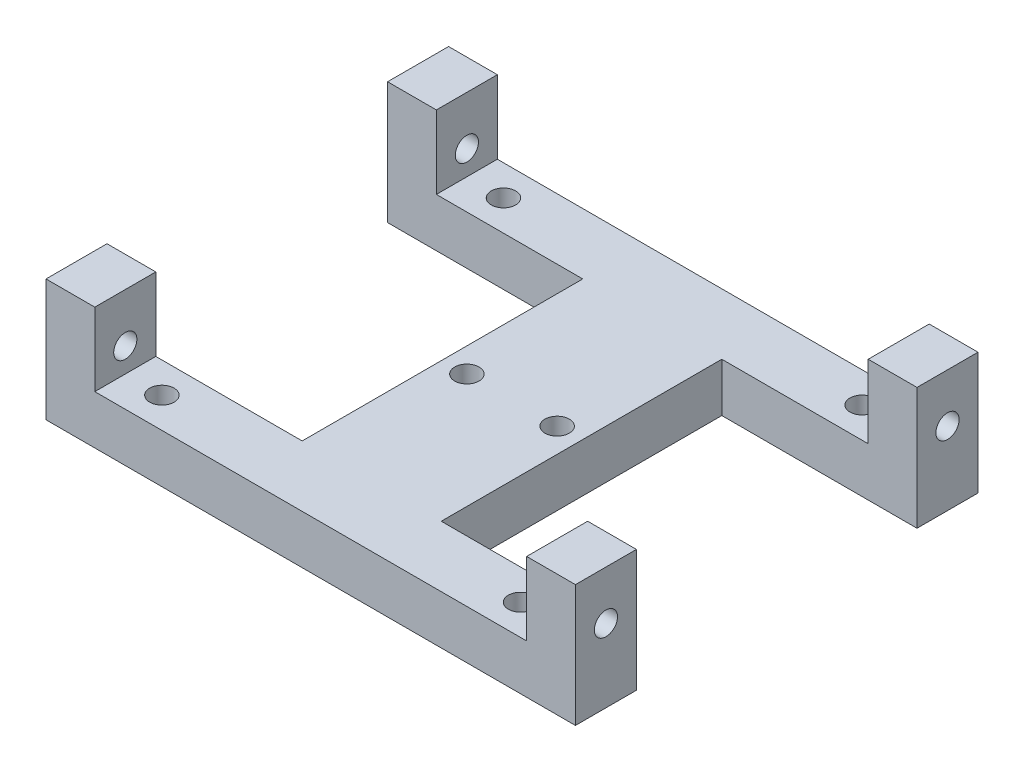
ISO-10303-21;
HEADER;
FILE_DESCRIPTION(('STEP AP214'),'2;1');
FILE_NAME('part.step','',(''),(''),'','','');
FILE_SCHEMA(('AUTOMOTIVE_DESIGN { 1 0 10303 214 1 1 1 1 }'));
ENDSEC;
DATA;
#1=APPLICATION_CONTEXT('core data for automotive mechanical design processes');
#2=APPLICATION_PROTOCOL_DEFINITION('international standard','automotive_design',2000,#1);
#3=PRODUCT_CONTEXT('',#1,'mechanical');
#4=PRODUCT('Part','Part','',(#3));
#5=PRODUCT_RELATED_PRODUCT_CATEGORY('part','',(#4));
#6=PRODUCT_DEFINITION_FORMATION('','',#4);
#7=PRODUCT_DEFINITION_CONTEXT('part definition',#1,'design');
#8=PRODUCT_DEFINITION('design','',#6,#7);
#9=PRODUCT_DEFINITION_SHAPE('','',#8);
#10=(LENGTH_UNIT() NAMED_UNIT(*) SI_UNIT(.MILLI.,.METRE.));
#11=(NAMED_UNIT(*) PLANE_ANGLE_UNIT() SI_UNIT($,.RADIAN.));
#12=(NAMED_UNIT(*) SI_UNIT($,.STERADIAN.) SOLID_ANGLE_UNIT());
#13=UNCERTAINTY_MEASURE_WITH_UNIT(LENGTH_MEASURE(1.E-05),#10,'distance_accuracy_value','');
#14=(GEOMETRIC_REPRESENTATION_CONTEXT(3) GLOBAL_UNCERTAINTY_ASSIGNED_CONTEXT((#13)) GLOBAL_UNIT_ASSIGNED_CONTEXT((#10,
#11,#12)) REPRESENTATION_CONTEXT('',''));
#15=CARTESIAN_POINT('',(0.,0.,0.));
#16=DIRECTION('',(0.,0.,1.));
#17=DIRECTION('',(1.,0.,0.));
#18=AXIS2_PLACEMENT_3D('',#15,#16,#17);
#19=CARTESIAN_POINT('',(0.,4.,0.));
#20=DIRECTION('',(0.,1.,0.));
#21=DIRECTION('',(0.,0.,1.));
#22=AXIS2_PLACEMENT_3D('',#19,#20,#21);
#23=PLANE('',#22);
#24=CARTESIAN_POINT('',(7.,4.,-25.5));
#25=DIRECTION('',(0.,1.,0.));
#26=DIRECTION('',(0.,0.,1.));
#27=AXIS2_PLACEMENT_3D('',#24,#25,#26);
#28=CIRCLE('',#27,1.);
#29=CARTESIAN_POINT('',(7.,4.,-24.5));
#30=VERTEX_POINT('',#29);
#31=EDGE_CURVE('E390',#30,#30,#28,.T.);
#32=ORIENTED_EDGE('',*,*,#31,.F.);
#33=EDGE_LOOP('',(#32));
#34=FACE_BOUND('',#33,.T.);
#35=CARTESIAN_POINT('',(18.,4.,-11.5));
#36=DIRECTION('',(0.,1.,0.));
#37=DIRECTION('',(0.,0.,1.));
#38=AXIS2_PLACEMENT_3D('',#35,#36,#37);
#39=CIRCLE('',#38,1.);
#40=CARTESIAN_POINT('',(18.,4.,-10.5));
#41=VERTEX_POINT('',#40);
#42=EDGE_CURVE('E384',#41,#41,#39,.T.);
#43=ORIENTED_EDGE('',*,*,#42,.F.);
#44=EDGE_LOOP('',(#43));
#45=FACE_BOUND('',#44,.T.);
#46=CARTESIAN_POINT('',(36.4,4.,2.5));
#47=DIRECTION('',(0.,1.,0.));
#48=DIRECTION('',(0.,0.,-1.));
#49=AXIS2_PLACEMENT_3D('',#46,#47,#48);
#50=CIRCLE('',#49,0.999999999999998);
#51=CARTESIAN_POINT('',(36.4,4.,1.5));
#52=VERTEX_POINT('',#51);
#53=EDGE_CURVE('E378',#52,#52,#50,.T.);
#54=ORIENTED_EDGE('',*,*,#53,.F.);
#55=EDGE_LOOP('',(#54));
#56=FACE_BOUND('',#55,.T.);
#57=CARTESIAN_POINT('',(36.4,4.,-25.5));
#58=DIRECTION('',(0.,1.,0.));
#59=DIRECTION('',(0.,0.,-1.));
#60=AXIS2_PLACEMENT_3D('',#57,#58,#59);
#61=CIRCLE('',#60,0.999999999999998);
#62=CARTESIAN_POINT('',(36.4,4.,-26.5));
#63=VERTEX_POINT('',#62);
#64=EDGE_CURVE('E371',#63,#63,#61,.T.);
#65=ORIENTED_EDGE('',*,*,#64,.F.);
#66=EDGE_LOOP('',(#65));
#67=FACE_BOUND('',#66,.T.);
#68=CARTESIAN_POINT('',(25.4,4.,-11.5));
#69=DIRECTION('',(0.,1.,0.));
#70=DIRECTION('',(0.,0.,-1.));
#71=AXIS2_PLACEMENT_3D('',#68,#69,#70);
#72=CIRCLE('',#71,1.);
#73=CARTESIAN_POINT('',(25.4,4.,-12.5));
#74=VERTEX_POINT('',#73);
#75=EDGE_CURVE('E395',#74,#74,#72,.T.);
#76=ORIENTED_EDGE('',*,*,#75,.F.);
#77=EDGE_LOOP('',(#76));
#78=FACE_BOUND('',#77,.T.);
#79=CARTESIAN_POINT('',(7.,4.,2.5));
#80=DIRECTION('',(0.,1.,0.));
#81=DIRECTION('',(0.,0.,1.));
#82=AXIS2_PLACEMENT_3D('',#79,#80,#81);
#83=CIRCLE('',#82,1.);
#84=CARTESIAN_POINT('',(7.,4.,3.5));
#85=VERTEX_POINT('',#84);
#86=EDGE_CURVE('E355',#85,#85,#83,.T.);
#87=ORIENTED_EDGE('',*,*,#86,.F.);
#88=EDGE_LOOP('',(#87));
#89=FACE_BOUND('',#88,.T.);
#90=DIRECTION('',(1.,0.,0.));
#91=VECTOR('',#90,1.);
#92=CARTESIAN_POINT('',(27.4,4.,-23.));
#93=LINE('',#92,#91);
#94=CARTESIAN_POINT('',(27.4,4.,-23.));
#95=VERTEX_POINT('',#94);
#96=CARTESIAN_POINT('',(39.4,4.,-23.));
#97=VERTEX_POINT('',#96);
#98=EDGE_CURVE('E56',#95,#97,#93,.T.);
#99=ORIENTED_EDGE('',*,*,#98,.T.);
#100=DIRECTION('',(0.,0.,1.));
#101=VECTOR('',#100,1.);
#102=CARTESIAN_POINT('',(39.4,4.,-28.));
#103=LINE('',#102,#101);
#104=CARTESIAN_POINT('',(39.4,4.,-28.));
#105=VERTEX_POINT('',#104);
#106=EDGE_CURVE('E205',#105,#97,#103,.T.);
#107=ORIENTED_EDGE('',*,*,#106,.F.);
#108=DIRECTION('',(-1.,0.,0.));
#109=VECTOR('',#108,1.);
#110=CARTESIAN_POINT('',(23.4,4.,-28.));
#111=LINE('',#110,#109);
#112=CARTESIAN_POINT('',(4.,4.,-28.));
#113=VERTEX_POINT('',#112);
#114=EDGE_CURVE('E285',#105,#113,#111,.T.);
#115=ORIENTED_EDGE('',*,*,#114,.T.);
#116=DIRECTION('',(0.,0.,-1.));
#117=VECTOR('',#116,1.);
#118=CARTESIAN_POINT('',(4.,4.,-28.));
#119=LINE('',#118,#117);
#120=CARTESIAN_POINT('',(4.,4.,-23.));
#121=VERTEX_POINT('',#120);
#122=EDGE_CURVE('E237',#121,#113,#119,.T.);
#123=ORIENTED_EDGE('',*,*,#122,.F.);
#124=DIRECTION('',(1.,0.,0.));
#125=VECTOR('',#124,1.);
#126=CARTESIAN_POINT('',(16.,4.,-23.));
#127=LINE('',#126,#125);
#128=CARTESIAN_POINT('',(16.,4.,-23.));
#129=VERTEX_POINT('',#128);
#130=EDGE_CURVE('E287',#121,#129,#127,.T.);
#131=ORIENTED_EDGE('',*,*,#130,.T.);
#132=DIRECTION('',(0.,0.,1.));
#133=VECTOR('',#132,1.);
#134=CARTESIAN_POINT('',(16.,4.,0.));
#135=LINE('',#134,#133);
#136=CARTESIAN_POINT('',(16.,4.,0.));
#137=VERTEX_POINT('',#136);
#138=EDGE_CURVE('E289',#129,#137,#135,.T.);
#139=ORIENTED_EDGE('',*,*,#138,.T.);
#140=DIRECTION('',(-1.,0.,0.));
#141=VECTOR('',#140,1.);
#142=CARTESIAN_POINT('',(0.,4.,0.));
#143=LINE('',#142,#141);
#144=CARTESIAN_POINT('',(4.,4.,0.));
#145=VERTEX_POINT('',#144);
#146=EDGE_CURVE('E276',#137,#145,#143,.T.);
#147=ORIENTED_EDGE('',*,*,#146,.T.);
#148=DIRECTION('',(0.,0.,-1.));
#149=VECTOR('',#148,1.);
#150=CARTESIAN_POINT('',(4.,4.,0.));
#151=LINE('',#150,#149);
#152=CARTESIAN_POINT('',(4.,4.,5.));
#153=VERTEX_POINT('',#152);
#154=EDGE_CURVE('E256',#153,#145,#151,.T.);
#155=ORIENTED_EDGE('',*,*,#154,.F.);
#156=DIRECTION('',(1.,0.,0.));
#157=VECTOR('',#156,1.);
#158=CARTESIAN_POINT('',(0.,4.,5.));
#159=LINE('',#158,#157);
#160=CARTESIAN_POINT('',(39.4,4.,5.));
#161=VERTEX_POINT('',#160);
#162=EDGE_CURVE('E63',#153,#161,#159,.T.);
#163=ORIENTED_EDGE('',*,*,#162,.T.);
#164=DIRECTION('',(0.,0.,1.));
#165=VECTOR('',#164,1.);
#166=CARTESIAN_POINT('',(39.4,4.,0.));
#167=LINE('',#166,#165);
#168=CARTESIAN_POINT('',(39.4,4.,0.));
#169=VERTEX_POINT('',#168);
#170=EDGE_CURVE('E218',#169,#161,#167,.T.);
#171=ORIENTED_EDGE('',*,*,#170,.F.);
#172=DIRECTION('',(-1.,0.,0.));
#173=VECTOR('',#172,1.);
#174=CARTESIAN_POINT('',(43.4,4.,0.));
#175=LINE('',#174,#173);
#176=CARTESIAN_POINT('',(27.4,4.,0.));
#177=VERTEX_POINT('',#176);
#178=EDGE_CURVE('E280',#169,#177,#175,.T.);
#179=ORIENTED_EDGE('',*,*,#178,.T.);
#180=DIRECTION('',(0.,0.,-1.));
#181=VECTOR('',#180,1.);
#182=CARTESIAN_POINT('',(27.4,4.,0.));
#183=LINE('',#182,#181);
#184=EDGE_CURVE('E282',#177,#95,#183,.T.);
#185=ORIENTED_EDGE('',*,*,#184,.T.);
#186=EDGE_LOOP('',(#99,#107,#115,#123,#131,#139,#147,#155,#163,#171,#179,#185));
#187=FACE_BOUND('',#186,.T.);
#188=ADVANCED_FACE('F39',(#34,#45,#56,#67,#78,#89,#187),#23,.T.);
#189=CARTESIAN_POINT('',(0.,4.,0.));
#190=DIRECTION('',(0.,0.,1.));
#191=DIRECTION('',(1.,0.,0.));
#192=AXIS2_PLACEMENT_3D('',#189,#190,#191);
#193=PLANE('',#192);
#194=DIRECTION('',(-1.,0.,0.));
#195=VECTOR('',#194,1.);
#196=CARTESIAN_POINT('',(0.,0.,0.));
#197=LINE('',#196,#195);
#198=CARTESIAN_POINT('',(16.,0.,0.));
#199=VERTEX_POINT('',#198);
#200=CARTESIAN_POINT('',(0.,0.,0.));
#201=VERTEX_POINT('',#200);
#202=EDGE_CURVE('E275',#199,#201,#197,.T.);
#203=ORIENTED_EDGE('',*,*,#202,.T.);
#204=DIRECTION('',(0.,-1.,0.));
#205=VECTOR('',#204,1.);
#206=CARTESIAN_POINT('',(0.,4.,0.));
#207=LINE('',#206,#205);
#208=CARTESIAN_POINT('',(0.,10.,0.));
#209=VERTEX_POINT('',#208);
#210=EDGE_CURVE('E11',#209,#201,#207,.T.);
#211=ORIENTED_EDGE('',*,*,#210,.F.);
#212=DIRECTION('',(-1.,0.,0.));
#213=VECTOR('',#212,1.);
#214=CARTESIAN_POINT('',(0.,10.,0.));
#215=LINE('',#214,#213);
#216=CARTESIAN_POINT('',(4.,10.,0.));
#217=VERTEX_POINT('',#216);
#218=EDGE_CURVE('E264',#217,#209,#215,.T.);
#219=ORIENTED_EDGE('',*,*,#218,.F.);
#220=DIRECTION('',(0.,-1.,0.));
#221=VECTOR('',#220,1.);
#222=CARTESIAN_POINT('',(4.,10.,0.));
#223=LINE('',#222,#221);
#224=EDGE_CURVE('E267',#217,#145,#223,.T.);
#225=ORIENTED_EDGE('',*,*,#224,.T.);
#226=ORIENTED_EDGE('',*,*,#146,.F.);
#227=DIRECTION('',(0.,-1.,0.));
#228=VECTOR('',#227,1.);
#229=CARTESIAN_POINT('',(16.,4.,0.));
#230=LINE('',#229,#228);
#231=EDGE_CURVE('E291',#137,#199,#230,.T.);
#232=ORIENTED_EDGE('',*,*,#231,.T.);
#233=EDGE_LOOP('',(#203,#211,#219,#225,#226,#232));
#234=FACE_BOUND('',#233,.T.);
#235=ADVANCED_FACE('F41',(#234),#193,.F.);
#236=CARTESIAN_POINT('',(0.,4.,0.));
#237=DIRECTION('',(1.,0.,0.));
#238=DIRECTION('',(0.,0.,-1.));
#239=AXIS2_PLACEMENT_3D('',#236,#237,#238);
#240=PLANE('',#239);
#241=CARTESIAN_POINT('',(0.,6.,2.5));
#242=DIRECTION('',(-1.,0.,0.));
#243=DIRECTION('',(0.,0.,1.));
#244=AXIS2_PLACEMENT_3D('',#241,#242,#243);
#245=CIRCLE('',#244,0.950000000000001);
#246=CARTESIAN_POINT('',(0.,6.,3.45));
#247=VERTEX_POINT('',#246);
#248=EDGE_CURVE('E347',#247,#247,#245,.T.);
#249=ORIENTED_EDGE('',*,*,#248,.F.);
#250=EDGE_LOOP('',(#249));
#251=FACE_BOUND('',#250,.T.);
#252=DIRECTION('',(0.,0.,1.));
#253=VECTOR('',#252,1.);
#254=CARTESIAN_POINT('',(0.,0.,0.));
#255=LINE('',#254,#253);
#256=CARTESIAN_POINT('',(0.,0.,5.));
#257=VERTEX_POINT('',#256);
#258=EDGE_CURVE('E294',#201,#257,#255,.T.);
#259=ORIENTED_EDGE('',*,*,#258,.T.);
#260=DIRECTION('',(0.,-1.,0.));
#261=VECTOR('',#260,1.);
#262=CARTESIAN_POINT('',(0.,4.,5.));
#263=LINE('',#262,#261);
#264=CARTESIAN_POINT('',(0.,10.,5.));
#265=VERTEX_POINT('',#264);
#266=EDGE_CURVE('E48',#265,#257,#263,.T.);
#267=ORIENTED_EDGE('',*,*,#266,.F.);
#268=DIRECTION('',(0.,0.,1.));
#269=VECTOR('',#268,1.);
#270=CARTESIAN_POINT('',(0.,10.,5.));
#271=LINE('',#270,#269);
#272=EDGE_CURVE('E257',#209,#265,#271,.T.);
#273=ORIENTED_EDGE('',*,*,#272,.F.);
#274=ORIENTED_EDGE('',*,*,#210,.T.);
#275=EDGE_LOOP('',(#259,#267,#273,#274));
#276=FACE_BOUND('',#275,.T.);
#277=ADVANCED_FACE('F500',(#251,#276),#240,.F.);
#278=CARTESIAN_POINT('',(43.4,4.,5.));
#279=DIRECTION('',(0.,0.,-1.));
#280=DIRECTION('',(-1.,0.,0.));
#281=AXIS2_PLACEMENT_3D('',#278,#279,#280);
#282=PLANE('',#281);
#283=DIRECTION('',(1.,0.,0.));
#284=VECTOR('',#283,1.);
#285=CARTESIAN_POINT('',(43.4,0.,5.));
#286=LINE('',#285,#284);
#287=CARTESIAN_POINT('',(43.4,0.,5.));
#288=VERTEX_POINT('',#287);
#289=EDGE_CURVE('E297',#257,#288,#286,.T.);
#290=ORIENTED_EDGE('',*,*,#289,.T.);
#291=DIRECTION('',(0.,-1.,0.));
#292=VECTOR('',#291,1.);
#293=CARTESIAN_POINT('',(43.4,4.,5.));
#294=LINE('',#293,#292);
#295=CARTESIAN_POINT('',(43.4,10.,5.));
#296=VERTEX_POINT('',#295);
#297=EDGE_CURVE('E335',#296,#288,#294,.T.);
#298=ORIENTED_EDGE('',*,*,#297,.F.);
#299=DIRECTION('',(1.,0.,0.));
#300=VECTOR('',#299,1.);
#301=CARTESIAN_POINT('',(39.4,10.,5.));
#302=LINE('',#301,#300);
#303=CARTESIAN_POINT('',(39.4,10.,5.));
#304=VERTEX_POINT('',#303);
#305=EDGE_CURVE('E222',#304,#296,#302,.T.);
#306=ORIENTED_EDGE('',*,*,#305,.F.);
#307=DIRECTION('',(0.,-1.,0.));
#308=VECTOR('',#307,1.);
#309=CARTESIAN_POINT('',(39.4,10.,5.));
#310=LINE('',#309,#308);
#311=EDGE_CURVE('E235',#304,#161,#310,.T.);
#312=ORIENTED_EDGE('',*,*,#311,.T.);
#313=ORIENTED_EDGE('',*,*,#162,.F.);
#314=DIRECTION('',(0.,-1.,0.));
#315=VECTOR('',#314,1.);
#316=CARTESIAN_POINT('',(4.,10.,5.));
#317=LINE('',#316,#315);
#318=CARTESIAN_POINT('',(4.,10.,5.));
#319=VERTEX_POINT('',#318);
#320=EDGE_CURVE('E272',#319,#153,#317,.T.);
#321=ORIENTED_EDGE('',*,*,#320,.F.);
#322=DIRECTION('',(1.,0.,0.));
#323=VECTOR('',#322,1.);
#324=CARTESIAN_POINT('',(4.,10.,5.));
#325=LINE('',#324,#323);
#326=EDGE_CURVE('E260',#265,#319,#325,.T.);
#327=ORIENTED_EDGE('',*,*,#326,.F.);
#328=ORIENTED_EDGE('',*,*,#266,.T.);
#329=EDGE_LOOP('',(#290,#298,#306,#312,#313,#321,#327,#328));
#330=FACE_BOUND('',#329,.T.);
#331=ADVANCED_FACE('F498',(#330),#282,.F.);
#332=CARTESIAN_POINT('',(43.4,4.,0.));
#333=DIRECTION('',(-1.,0.,0.));
#334=DIRECTION('',(0.,0.,1.));
#335=AXIS2_PLACEMENT_3D('',#332,#333,#334);
#336=PLANE('',#335);
#337=CARTESIAN_POINT('',(43.4,6.,2.49999999999999));
#338=DIRECTION('',(-1.,0.,0.));
#339=DIRECTION('',(0.,0.,1.));
#340=AXIS2_PLACEMENT_3D('',#337,#338,#339);
#341=CIRCLE('',#340,0.950000000000001);
#342=CARTESIAN_POINT('',(43.4,6.,3.45));
#343=VERTEX_POINT('',#342);
#344=EDGE_CURVE('E342',#343,#343,#341,.T.);
#345=ORIENTED_EDGE('',*,*,#344,.T.);
#346=EDGE_LOOP('',(#345));
#347=FACE_BOUND('',#346,.T.);
#348=DIRECTION('',(0.,0.,-1.));
#349=VECTOR('',#348,1.);
#350=CARTESIAN_POINT('',(43.4,0.,0.));
#351=LINE('',#350,#349);
#352=CARTESIAN_POINT('',(43.4,0.,0.));
#353=VERTEX_POINT('',#352);
#354=EDGE_CURVE('E299',#288,#353,#351,.T.);
#355=ORIENTED_EDGE('',*,*,#354,.T.);
#356=DIRECTION('',(0.,-1.,0.));
#357=VECTOR('',#356,1.);
#358=CARTESIAN_POINT('',(43.4,4.,0.));
#359=LINE('',#358,#357);
#360=CARTESIAN_POINT('',(43.4,10.,0.));
#361=VERTEX_POINT('',#360);
#362=EDGE_CURVE('E332',#361,#353,#359,.T.);
#363=ORIENTED_EDGE('',*,*,#362,.F.);
#364=DIRECTION('',(0.,0.,-1.));
#365=VECTOR('',#364,1.);
#366=CARTESIAN_POINT('',(43.4,10.,5.));
#367=LINE('',#366,#365);
#368=EDGE_CURVE('E225',#296,#361,#367,.T.);
#369=ORIENTED_EDGE('',*,*,#368,.F.);
#370=ORIENTED_EDGE('',*,*,#297,.T.);
#371=EDGE_LOOP('',(#355,#363,#369,#370));
#372=FACE_BOUND('',#371,.T.);
#373=ADVANCED_FACE('F494',(#347,#372),#336,.F.);
#374=CARTESIAN_POINT('',(43.4,4.,0.));
#375=DIRECTION('',(0.,0.,1.));
#376=DIRECTION('',(1.,0.,0.));
#377=AXIS2_PLACEMENT_3D('',#374,#375,#376);
#378=PLANE('',#377);
#379=DIRECTION('',(-1.,0.,0.));
#380=VECTOR('',#379,1.);
#381=CARTESIAN_POINT('',(43.4,0.,0.));
#382=LINE('',#381,#380);
#383=CARTESIAN_POINT('',(27.4,0.,0.));
#384=VERTEX_POINT('',#383);
#385=EDGE_CURVE('E301',#353,#384,#382,.T.);
#386=ORIENTED_EDGE('',*,*,#385,.T.);
#387=DIRECTION('',(0.,-1.,0.));
#388=VECTOR('',#387,1.);
#389=CARTESIAN_POINT('',(27.4,4.,0.));
#390=LINE('',#389,#388);
#391=EDGE_CURVE('E329',#177,#384,#390,.T.);
#392=ORIENTED_EDGE('',*,*,#391,.F.);
#393=ORIENTED_EDGE('',*,*,#178,.F.);
#394=DIRECTION('',(0.,-1.,0.));
#395=VECTOR('',#394,1.);
#396=CARTESIAN_POINT('',(39.4,10.,0.));
#397=LINE('',#396,#395);
#398=CARTESIAN_POINT('',(39.4,10.,0.));
#399=VERTEX_POINT('',#398);
#400=EDGE_CURVE('E230',#399,#169,#397,.T.);
#401=ORIENTED_EDGE('',*,*,#400,.F.);
#402=DIRECTION('',(-1.,0.,0.));
#403=VECTOR('',#402,1.);
#404=CARTESIAN_POINT('',(43.4,10.,0.));
#405=LINE('',#404,#403);
#406=EDGE_CURVE('E228',#361,#399,#405,.T.);
#407=ORIENTED_EDGE('',*,*,#406,.F.);
#408=ORIENTED_EDGE('',*,*,#362,.T.);
#409=EDGE_LOOP('',(#386,#392,#393,#401,#407,#408));
#410=FACE_BOUND('',#409,.T.);
#411=ADVANCED_FACE('F490',(#410),#378,.F.);
#412=CARTESIAN_POINT('',(27.4,4.,0.));
#413=DIRECTION('',(-1.,0.,0.));
#414=DIRECTION('',(0.,0.,1.));
#415=AXIS2_PLACEMENT_3D('',#412,#413,#414);
#416=PLANE('',#415);
#417=DIRECTION('',(0.,0.,-1.));
#418=VECTOR('',#417,1.);
#419=CARTESIAN_POINT('',(27.4,0.,0.));
#420=LINE('',#419,#418);
#421=CARTESIAN_POINT('',(27.4,0.,-23.));
#422=VERTEX_POINT('',#421);
#423=EDGE_CURVE('E303',#384,#422,#420,.T.);
#424=ORIENTED_EDGE('',*,*,#423,.T.);
#425=DIRECTION('',(0.,-1.,0.));
#426=VECTOR('',#425,1.);
#427=CARTESIAN_POINT('',(27.4,4.,-23.));
#428=LINE('',#427,#426);
#429=EDGE_CURVE('E326',#95,#422,#428,.T.);
#430=ORIENTED_EDGE('',*,*,#429,.F.);
#431=ORIENTED_EDGE('',*,*,#184,.F.);
#432=ORIENTED_EDGE('',*,*,#391,.T.);
#433=EDGE_LOOP('',(#424,#430,#431,#432));
#434=FACE_BOUND('',#433,.T.);
#435=ADVANCED_FACE('F486',(#434),#416,.F.);
#436=CARTESIAN_POINT('',(27.4,4.,-23.));
#437=DIRECTION('',(0.,0.,-1.));
#438=DIRECTION('',(-1.,0.,0.));
#439=AXIS2_PLACEMENT_3D('',#436,#437,#438);
#440=PLANE('',#439);
#441=DIRECTION('',(1.,0.,0.));
#442=VECTOR('',#441,1.);
#443=CARTESIAN_POINT('',(27.4,0.,-23.));
#444=LINE('',#443,#442);
#445=CARTESIAN_POINT('',(43.4,0.,-23.));
#446=VERTEX_POINT('',#445);
#447=EDGE_CURVE('E305',#422,#446,#444,.T.);
#448=ORIENTED_EDGE('',*,*,#447,.T.);
#449=DIRECTION('',(0.,-1.,0.));
#450=VECTOR('',#449,1.);
#451=CARTESIAN_POINT('',(43.4,4.,-23.));
#452=LINE('',#451,#450);
#453=CARTESIAN_POINT('',(43.4,10.,-23.));
#454=VERTEX_POINT('',#453);
#455=EDGE_CURVE('E189',#454,#446,#452,.T.);
#456=ORIENTED_EDGE('',*,*,#455,.F.);
#457=DIRECTION('',(1.,0.,0.));
#458=VECTOR('',#457,1.);
#459=CARTESIAN_POINT('',(39.4,10.,-23.));
#460=LINE('',#459,#458);
#461=CARTESIAN_POINT('',(39.4,10.,-23.));
#462=VERTEX_POINT('',#461);
#463=EDGE_CURVE('E204',#462,#454,#460,.T.);
#464=ORIENTED_EDGE('',*,*,#463,.F.);
#465=DIRECTION('',(0.,-1.,0.));
#466=VECTOR('',#465,1.);
#467=CARTESIAN_POINT('',(39.4,10.,-23.));
#468=LINE('',#467,#466);
#469=EDGE_CURVE('E213',#462,#97,#468,.T.);
#470=ORIENTED_EDGE('',*,*,#469,.T.);
#471=ORIENTED_EDGE('',*,*,#98,.F.);
#472=ORIENTED_EDGE('',*,*,#429,.T.);
#473=EDGE_LOOP('',(#448,#456,#464,#470,#471,#472));
#474=FACE_BOUND('',#473,.T.);
#475=ADVANCED_FACE('F482',(#474),#440,.F.);
#476=CARTESIAN_POINT('',(43.4,4.,-23.));
#477=DIRECTION('',(-1.,0.,0.));
#478=DIRECTION('',(0.,0.,1.));
#479=AXIS2_PLACEMENT_3D('',#476,#477,#478);
#480=PLANE('',#479);
#481=CARTESIAN_POINT('',(43.4,6.,-25.5));
#482=DIRECTION('',(-1.,0.,0.));
#483=DIRECTION('',(0.,0.,1.));
#484=AXIS2_PLACEMENT_3D('',#481,#482,#483);
#485=CIRCLE('',#484,0.950000000000001);
#486=CARTESIAN_POINT('',(43.4,6.,-24.55));
#487=VERTEX_POINT('',#486);
#488=EDGE_CURVE('E352',#487,#487,#485,.T.);
#489=ORIENTED_EDGE('',*,*,#488,.T.);
#490=EDGE_LOOP('',(#489));
#491=FACE_BOUND('',#490,.T.);
#492=DIRECTION('',(0.,0.,-1.));
#493=VECTOR('',#492,1.);
#494=CARTESIAN_POINT('',(43.4,0.,-23.));
#495=LINE('',#494,#493);
#496=CARTESIAN_POINT('',(43.4,0.,-28.));
#497=VERTEX_POINT('',#496);
#498=EDGE_CURVE('E187',#446,#497,#495,.T.);
#499=ORIENTED_EDGE('',*,*,#498,.T.);
#500=DIRECTION('',(0.,-1.,0.));
#501=VECTOR('',#500,1.);
#502=CARTESIAN_POINT('',(43.4,4.,-28.));
#503=LINE('',#502,#501);
#504=CARTESIAN_POINT('',(43.4,10.,-28.));
#505=VERTEX_POINT('',#504);
#506=EDGE_CURVE('E180',#505,#497,#503,.T.);
#507=ORIENTED_EDGE('',*,*,#506,.F.);
#508=DIRECTION('',(0.,0.,-1.));
#509=VECTOR('',#508,1.);
#510=CARTESIAN_POINT('',(43.4,10.,-23.));
#511=LINE('',#510,#509);
#512=EDGE_CURVE('E185',#454,#505,#511,.T.);
#513=ORIENTED_EDGE('',*,*,#512,.F.);
#514=ORIENTED_EDGE('',*,*,#455,.T.);
#515=EDGE_LOOP('',(#499,#507,#513,#514));
#516=FACE_BOUND('',#515,.T.);
#517=ADVANCED_FACE('F182',(#491,#516),#480,.F.);
#518=CARTESIAN_POINT('',(20.,4.,-28.));
#519=DIRECTION('',(0.,0.,1.));
#520=DIRECTION('',(1.,0.,0.));
#521=AXIS2_PLACEMENT_3D('',#518,#519,#520);
#522=PLANE('',#521);
#523=DIRECTION('',(-1.,0.,0.));
#524=VECTOR('',#523,1.);
#525=CARTESIAN_POINT('',(20.,0.,-28.));
#526=LINE('',#525,#524);
#527=CARTESIAN_POINT('',(0.,0.,-28.));
#528=VERTEX_POINT('',#527);
#529=EDGE_CURVE('E308',#497,#528,#526,.T.);
#530=ORIENTED_EDGE('',*,*,#529,.T.);
#531=DIRECTION('',(0.,-1.,0.));
#532=VECTOR('',#531,1.);
#533=CARTESIAN_POINT('',(0.,4.,-28.));
#534=LINE('',#533,#532);
#535=CARTESIAN_POINT('',(0.,10.,-28.));
#536=VERTEX_POINT('',#535);
#537=EDGE_CURVE('E190',#536,#528,#534,.T.);
#538=ORIENTED_EDGE('',*,*,#537,.F.);
#539=DIRECTION('',(-1.,0.,0.));
#540=VECTOR('',#539,1.);
#541=CARTESIAN_POINT('',(0.,10.,-28.));
#542=LINE('',#541,#540);
#543=CARTESIAN_POINT('',(4.,10.,-28.));
#544=VERTEX_POINT('',#543);
#545=EDGE_CURVE('E245',#544,#536,#542,.T.);
#546=ORIENTED_EDGE('',*,*,#545,.F.);
#547=DIRECTION('',(0.,-1.,0.));
#548=VECTOR('',#547,1.);
#549=CARTESIAN_POINT('',(4.,10.,-28.));
#550=LINE('',#549,#548);
#551=EDGE_CURVE('E248',#544,#113,#550,.T.);
#552=ORIENTED_EDGE('',*,*,#551,.T.);
#553=ORIENTED_EDGE('',*,*,#114,.F.);
#554=DIRECTION('',(0.,-1.,0.));
#555=VECTOR('',#554,1.);
#556=CARTESIAN_POINT('',(39.4,10.,-28.));
#557=LINE('',#556,#555);
#558=CARTESIAN_POINT('',(39.4,10.,-28.));
#559=VERTEX_POINT('',#558);
#560=EDGE_CURVE('E196',#559,#105,#557,.T.);
#561=ORIENTED_EDGE('',*,*,#560,.F.);
#562=DIRECTION('',(-1.,0.,0.));
#563=VECTOR('',#562,1.);
#564=CARTESIAN_POINT('',(43.4,10.,-28.));
#565=LINE('',#564,#563);
#566=EDGE_CURVE('E193',#505,#559,#565,.T.);
#567=ORIENTED_EDGE('',*,*,#566,.F.);
#568=ORIENTED_EDGE('',*,*,#506,.T.);
#569=EDGE_LOOP('',(#530,#538,#546,#552,#553,#561,#567,#568));
#570=FACE_BOUND('',#569,.T.);
#571=ADVANCED_FACE('F194',(#570),#522,.F.);
#572=CARTESIAN_POINT('',(0.,4.,-23.));
#573=DIRECTION('',(1.,0.,0.));
#574=DIRECTION('',(0.,0.,-1.));
#575=AXIS2_PLACEMENT_3D('',#572,#573,#574);
#576=PLANE('',#575);
#577=CARTESIAN_POINT('',(0.,6.,-25.5));
#578=DIRECTION('',(-1.,0.,0.));
#579=DIRECTION('',(0.,0.,1.));
#580=AXIS2_PLACEMENT_3D('',#577,#578,#579);
#581=CIRCLE('',#580,0.950000000000001);
#582=CARTESIAN_POINT('',(0.,6.,-24.55));
#583=VERTEX_POINT('',#582);
#584=EDGE_CURVE('E360',#583,#583,#581,.T.);
#585=ORIENTED_EDGE('',*,*,#584,.F.);
#586=EDGE_LOOP('',(#585));
#587=FACE_BOUND('',#586,.T.);
#588=DIRECTION('',(0.,0.,1.));
#589=VECTOR('',#588,1.);
#590=CARTESIAN_POINT('',(0.,0.,-23.));
#591=LINE('',#590,#589);
#592=CARTESIAN_POINT('',(0.,0.,-23.));
#593=VERTEX_POINT('',#592);
#594=EDGE_CURVE('E310',#528,#593,#591,.T.);
#595=ORIENTED_EDGE('',*,*,#594,.T.);
#596=DIRECTION('',(0.,-1.,0.));
#597=VECTOR('',#596,1.);
#598=CARTESIAN_POINT('',(0.,4.,-23.));
#599=LINE('',#598,#597);
#600=CARTESIAN_POINT('',(0.,10.,-23.));
#601=VERTEX_POINT('',#600);
#602=EDGE_CURVE('E320',#601,#593,#599,.T.);
#603=ORIENTED_EDGE('',*,*,#602,.F.);
#604=DIRECTION('',(0.,0.,1.));
#605=VECTOR('',#604,1.);
#606=CARTESIAN_POINT('',(0.,10.,-23.));
#607=LINE('',#606,#605);
#608=EDGE_CURVE('E238',#536,#601,#607,.T.);
#609=ORIENTED_EDGE('',*,*,#608,.F.);
#610=ORIENTED_EDGE('',*,*,#537,.T.);
#611=EDGE_LOOP('',(#595,#603,#609,#610));
#612=FACE_BOUND('',#611,.T.);
#613=ADVANCED_FACE('F473',(#587,#612),#576,.F.);
#614=CARTESIAN_POINT('',(16.,4.,-23.));
#615=DIRECTION('',(0.,0.,-1.));
#616=DIRECTION('',(-1.,0.,0.));
#617=AXIS2_PLACEMENT_3D('',#614,#615,#616);
#618=PLANE('',#617);
#619=DIRECTION('',(1.,0.,0.));
#620=VECTOR('',#619,1.);
#621=CARTESIAN_POINT('',(16.,0.,-23.));
#622=LINE('',#621,#620);
#623=CARTESIAN_POINT('',(16.,0.,-23.));
#624=VERTEX_POINT('',#623);
#625=EDGE_CURVE('E312',#593,#624,#622,.T.);
#626=ORIENTED_EDGE('',*,*,#625,.T.);
#627=DIRECTION('',(0.,-1.,0.));
#628=VECTOR('',#627,1.);
#629=CARTESIAN_POINT('',(16.,4.,-23.));
#630=LINE('',#629,#628);
#631=EDGE_CURVE('E317',#129,#624,#630,.T.);
#632=ORIENTED_EDGE('',*,*,#631,.F.);
#633=ORIENTED_EDGE('',*,*,#130,.F.);
#634=DIRECTION('',(0.,-1.,0.));
#635=VECTOR('',#634,1.);
#636=CARTESIAN_POINT('',(4.,10.,-23.));
#637=LINE('',#636,#635);
#638=CARTESIAN_POINT('',(4.,10.,-23.));
#639=VERTEX_POINT('',#638);
#640=EDGE_CURVE('E253',#639,#121,#637,.T.);
#641=ORIENTED_EDGE('',*,*,#640,.F.);
#642=DIRECTION('',(1.,0.,0.));
#643=VECTOR('',#642,1.);
#644=CARTESIAN_POINT('',(4.,10.,-23.));
#645=LINE('',#644,#643);
#646=EDGE_CURVE('E241',#601,#639,#645,.T.);
#647=ORIENTED_EDGE('',*,*,#646,.F.);
#648=ORIENTED_EDGE('',*,*,#602,.T.);
#649=EDGE_LOOP('',(#626,#632,#633,#641,#647,#648));
#650=FACE_BOUND('',#649,.T.);
#651=ADVANCED_FACE('F469',(#650),#618,.F.);
#652=CARTESIAN_POINT('',(16.,4.,0.));
#653=DIRECTION('',(1.,0.,0.));
#654=DIRECTION('',(0.,0.,-1.));
#655=AXIS2_PLACEMENT_3D('',#652,#653,#654);
#656=PLANE('',#655);
#657=DIRECTION('',(0.,0.,1.));
#658=VECTOR('',#657,1.);
#659=CARTESIAN_POINT('',(16.,0.,0.));
#660=LINE('',#659,#658);
#661=EDGE_CURVE('E278',#624,#199,#660,.T.);
#662=ORIENTED_EDGE('',*,*,#661,.T.);
#663=ORIENTED_EDGE('',*,*,#231,.F.);
#664=ORIENTED_EDGE('',*,*,#138,.F.);
#665=ORIENTED_EDGE('',*,*,#631,.T.);
#666=EDGE_LOOP('',(#662,#663,#664,#665));
#667=FACE_BOUND('',#666,.T.);
#668=ADVANCED_FACE('F465',(#667),#656,.F.);
#669=CARTESIAN_POINT('',(0.,0.,0.));
#670=DIRECTION('',(0.,1.,0.));
#671=DIRECTION('',(0.,0.,1.));
#672=AXIS2_PLACEMENT_3D('',#669,#670,#671);
#673=PLANE('',#672);
#674=CARTESIAN_POINT('',(7.,0.,-25.5));
#675=DIRECTION('',(0.,1.,0.));
#676=DIRECTION('',(0.,0.,1.));
#677=AXIS2_PLACEMENT_3D('',#674,#675,#676);
#678=CIRCLE('',#677,1.);
#679=CARTESIAN_POINT('',(7.,0.,-24.5));
#680=VERTEX_POINT('',#679);
#681=EDGE_CURVE('E369',#680,#680,#678,.T.);
#682=ORIENTED_EDGE('',*,*,#681,.T.);
#683=EDGE_LOOP('',(#682));
#684=FACE_BOUND('',#683,.T.);
#685=CARTESIAN_POINT('',(18.,0.,-11.5));
#686=DIRECTION('',(0.,1.,0.));
#687=DIRECTION('',(0.,0.,1.));
#688=AXIS2_PLACEMENT_3D('',#685,#686,#687);
#689=CIRCLE('',#688,1.);
#690=CARTESIAN_POINT('',(18.,0.,-10.5));
#691=VERTEX_POINT('',#690);
#692=EDGE_CURVE('E387',#691,#691,#689,.T.);
#693=ORIENTED_EDGE('',*,*,#692,.T.);
#694=EDGE_LOOP('',(#693));
#695=FACE_BOUND('',#694,.T.);
#696=CARTESIAN_POINT('',(36.4,0.,2.5));
#697=DIRECTION('',(0.,1.,0.));
#698=DIRECTION('',(0.,0.,-1.));
#699=AXIS2_PLACEMENT_3D('',#696,#697,#698);
#700=CIRCLE('',#699,0.999999999999998);
#701=CARTESIAN_POINT('',(36.4,0.,1.5));
#702=VERTEX_POINT('',#701);
#703=EDGE_CURVE('E381',#702,#702,#700,.T.);
#704=ORIENTED_EDGE('',*,*,#703,.T.);
#705=EDGE_LOOP('',(#704));
#706=FACE_BOUND('',#705,.T.);
#707=CARTESIAN_POINT('',(36.4,0.,-25.5));
#708=DIRECTION('',(0.,1.,0.));
#709=DIRECTION('',(0.,0.,-1.));
#710=AXIS2_PLACEMENT_3D('',#707,#708,#709);
#711=CIRCLE('',#710,0.999999999999998);
#712=CARTESIAN_POINT('',(36.4,0.,-26.5));
#713=VERTEX_POINT('',#712);
#714=EDGE_CURVE('E374',#713,#713,#711,.T.);
#715=ORIENTED_EDGE('',*,*,#714,.T.);
#716=EDGE_LOOP('',(#715));
#717=FACE_BOUND('',#716,.T.);
#718=CARTESIAN_POINT('',(25.4,0.,-11.5));
#719=DIRECTION('',(0.,1.,0.));
#720=DIRECTION('',(0.,0.,-1.));
#721=AXIS2_PLACEMENT_3D('',#718,#719,#720);
#722=CIRCLE('',#721,1.);
#723=CARTESIAN_POINT('',(25.4,0.,-12.5));
#724=VERTEX_POINT('',#723);
#725=EDGE_CURVE('E375',#724,#724,#722,.T.);
#726=ORIENTED_EDGE('',*,*,#725,.T.);
#727=EDGE_LOOP('',(#726));
#728=FACE_BOUND('',#727,.T.);
#729=CARTESIAN_POINT('',(7.,0.,2.5));
#730=DIRECTION('',(0.,1.,0.));
#731=DIRECTION('',(0.,0.,1.));
#732=AXIS2_PLACEMENT_3D('',#729,#730,#731);
#733=CIRCLE('',#732,1.);
#734=CARTESIAN_POINT('',(7.,0.,3.5));
#735=VERTEX_POINT('',#734);
#736=EDGE_CURVE('E362',#735,#735,#733,.T.);
#737=ORIENTED_EDGE('',*,*,#736,.T.);
#738=EDGE_LOOP('',(#737));
#739=FACE_BOUND('',#738,.T.);
#740=ORIENTED_EDGE('',*,*,#202,.F.);
#741=ORIENTED_EDGE('',*,*,#661,.F.);
#742=ORIENTED_EDGE('',*,*,#625,.F.);
#743=ORIENTED_EDGE('',*,*,#594,.F.);
#744=ORIENTED_EDGE('',*,*,#529,.F.);
#745=ORIENTED_EDGE('',*,*,#498,.F.);
#746=ORIENTED_EDGE('',*,*,#447,.F.);
#747=ORIENTED_EDGE('',*,*,#423,.F.);
#748=ORIENTED_EDGE('',*,*,#385,.F.);
#749=ORIENTED_EDGE('',*,*,#354,.F.);
#750=ORIENTED_EDGE('',*,*,#289,.F.);
#751=ORIENTED_EDGE('',*,*,#258,.F.);
#752=EDGE_LOOP('',(#740,#741,#742,#743,#744,#745,#746,#747,#748,#749,#750,#751));
#753=FACE_BOUND('',#752,.T.);
#754=ADVANCED_FACE('F401',(#684,#695,#706,#717,#728,#739,#753),#673,.F.);
#755=CARTESIAN_POINT('',(4.,10.,0.));
#756=DIRECTION('',(-1.,0.,0.));
#757=DIRECTION('',(0.,0.,1.));
#758=AXIS2_PLACEMENT_3D('',#755,#756,#757);
#759=PLANE('',#758);
#760=CARTESIAN_POINT('',(4.,6.,2.5));
#761=DIRECTION('',(-1.,0.,0.));
#762=DIRECTION('',(0.,0.,1.));
#763=AXIS2_PLACEMENT_3D('',#760,#761,#762);
#764=CIRCLE('',#763,0.950000000000001);
#765=CARTESIAN_POINT('',(4.,6.,3.45));
#766=VERTEX_POINT('',#765);
#767=EDGE_CURVE('E207',#766,#766,#764,.T.);
#768=ORIENTED_EDGE('',*,*,#767,.T.);
#769=EDGE_LOOP('',(#768));
#770=FACE_BOUND('',#769,.T.);
#771=ORIENTED_EDGE('',*,*,#154,.T.);
#772=ORIENTED_EDGE('',*,*,#224,.F.);
#773=DIRECTION('',(0.,0.,-1.));
#774=VECTOR('',#773,1.);
#775=CARTESIAN_POINT('',(4.,10.,0.));
#776=LINE('',#775,#774);
#777=EDGE_CURVE('E262',#319,#217,#776,.T.);
#778=ORIENTED_EDGE('',*,*,#777,.F.);
#779=ORIENTED_EDGE('',*,*,#320,.T.);
#780=EDGE_LOOP('',(#771,#772,#778,#779));
#781=FACE_BOUND('',#780,.T.);
#782=ADVANCED_FACE('F458',(#770,#781),#759,.F.);
#783=CARTESIAN_POINT('',(0.,10.,0.));
#784=DIRECTION('',(0.,-1.,0.));
#785=DIRECTION('',(0.,0.,-1.));
#786=AXIS2_PLACEMENT_3D('',#783,#784,#785);
#787=PLANE('',#786);
#788=ORIENTED_EDGE('',*,*,#272,.T.);
#789=ORIENTED_EDGE('',*,*,#326,.T.);
#790=ORIENTED_EDGE('',*,*,#777,.T.);
#791=ORIENTED_EDGE('',*,*,#218,.T.);
#792=EDGE_LOOP('',(#788,#789,#790,#791));
#793=FACE_BOUND('',#792,.T.);
#794=ADVANCED_FACE('F454',(#793),#787,.F.);
#795=CARTESIAN_POINT('',(4.,10.,-28.));
#796=DIRECTION('',(-1.,0.,0.));
#797=DIRECTION('',(0.,0.,1.));
#798=AXIS2_PLACEMENT_3D('',#795,#796,#797);
#799=PLANE('',#798);
#800=CARTESIAN_POINT('',(4.,6.,-25.5));
#801=DIRECTION('',(-1.,0.,0.));
#802=DIRECTION('',(0.,0.,1.));
#803=AXIS2_PLACEMENT_3D('',#800,#801,#802);
#804=CIRCLE('',#803,0.950000000000001);
#805=CARTESIAN_POINT('',(4.,6.,-24.55));
#806=VERTEX_POINT('',#805);
#807=EDGE_CURVE('E341',#806,#806,#804,.T.);
#808=ORIENTED_EDGE('',*,*,#807,.T.);
#809=EDGE_LOOP('',(#808));
#810=FACE_BOUND('',#809,.T.);
#811=ORIENTED_EDGE('',*,*,#122,.T.);
#812=ORIENTED_EDGE('',*,*,#551,.F.);
#813=DIRECTION('',(0.,0.,-1.));
#814=VECTOR('',#813,1.);
#815=CARTESIAN_POINT('',(4.,10.,-28.));
#816=LINE('',#815,#814);
#817=EDGE_CURVE('E243',#639,#544,#816,.T.);
#818=ORIENTED_EDGE('',*,*,#817,.F.);
#819=ORIENTED_EDGE('',*,*,#640,.T.);
#820=EDGE_LOOP('',(#811,#812,#818,#819));
#821=FACE_BOUND('',#820,.T.);
#822=ADVANCED_FACE('F450',(#810,#821),#799,.F.);
#823=CARTESIAN_POINT('',(0.,10.,0.));
#824=DIRECTION('',(0.,-1.,0.));
#825=DIRECTION('',(0.,0.,-1.));
#826=AXIS2_PLACEMENT_3D('',#823,#824,#825);
#827=PLANE('',#826);
#828=ORIENTED_EDGE('',*,*,#608,.T.);
#829=ORIENTED_EDGE('',*,*,#646,.T.);
#830=ORIENTED_EDGE('',*,*,#817,.T.);
#831=ORIENTED_EDGE('',*,*,#545,.T.);
#832=EDGE_LOOP('',(#828,#829,#830,#831));
#833=FACE_BOUND('',#832,.T.);
#834=ADVANCED_FACE('F446',(#833),#827,.F.);
#835=CARTESIAN_POINT('',(39.4,10.,0.));
#836=DIRECTION('',(1.,0.,0.));
#837=DIRECTION('',(0.,0.,-1.));
#838=AXIS2_PLACEMENT_3D('',#835,#836,#837);
#839=PLANE('',#838);
#840=CARTESIAN_POINT('',(39.4,6.,2.5));
#841=DIRECTION('',(1.,0.,0.));
#842=DIRECTION('',(0.,0.,-1.));
#843=AXIS2_PLACEMENT_3D('',#840,#841,#842);
#844=CIRCLE('',#843,0.950000000000001);
#845=CARTESIAN_POINT('',(39.4,6.,1.54999999999999));
#846=VERTEX_POINT('',#845);
#847=EDGE_CURVE('E43',#846,#846,#844,.T.);
#848=ORIENTED_EDGE('',*,*,#847,.T.);
#849=EDGE_LOOP('',(#848));
#850=FACE_BOUND('',#849,.T.);
#851=ORIENTED_EDGE('',*,*,#170,.T.);
#852=ORIENTED_EDGE('',*,*,#311,.F.);
#853=DIRECTION('',(0.,0.,1.));
#854=VECTOR('',#853,1.);
#855=CARTESIAN_POINT('',(39.4,10.,0.));
#856=LINE('',#855,#854);
#857=EDGE_CURVE('E219',#399,#304,#856,.T.);
#858=ORIENTED_EDGE('',*,*,#857,.F.);
#859=ORIENTED_EDGE('',*,*,#400,.T.);
#860=EDGE_LOOP('',(#851,#852,#858,#859));
#861=FACE_BOUND('',#860,.T.);
#862=ADVANCED_FACE('F442',(#850,#861),#839,.F.);
#863=CARTESIAN_POINT('',(0.,10.,0.));
#864=DIRECTION('',(0.,1.,0.));
#865=DIRECTION('',(0.,0.,1.));
#866=AXIS2_PLACEMENT_3D('',#863,#864,#865);
#867=PLANE('',#866);
#868=ORIENTED_EDGE('',*,*,#857,.T.);
#869=ORIENTED_EDGE('',*,*,#305,.T.);
#870=ORIENTED_EDGE('',*,*,#368,.T.);
#871=ORIENTED_EDGE('',*,*,#406,.T.);
#872=EDGE_LOOP('',(#868,#869,#870,#871));
#873=FACE_BOUND('',#872,.T.);
#874=ADVANCED_FACE('F439',(#873),#867,.T.);
#875=CARTESIAN_POINT('',(39.4,10.,-28.));
#876=DIRECTION('',(1.,0.,0.));
#877=DIRECTION('',(0.,0.,-1.));
#878=AXIS2_PLACEMENT_3D('',#875,#876,#877);
#879=PLANE('',#878);
#880=CARTESIAN_POINT('',(39.4,6.,-25.5));
#881=DIRECTION('',(1.,0.,0.));
#882=DIRECTION('',(0.,0.,-1.));
#883=AXIS2_PLACEMENT_3D('',#880,#881,#882);
#884=CIRCLE('',#883,0.950000000000001);
#885=CARTESIAN_POINT('',(39.4,6.,-26.45));
#886=VERTEX_POINT('',#885);
#887=EDGE_CURVE('E339',#886,#886,#884,.T.);
#888=ORIENTED_EDGE('',*,*,#887,.T.);
#889=EDGE_LOOP('',(#888));
#890=FACE_BOUND('',#889,.T.);
#891=ORIENTED_EDGE('',*,*,#106,.T.);
#892=ORIENTED_EDGE('',*,*,#469,.F.);
#893=DIRECTION('',(0.,0.,1.));
#894=VECTOR('',#893,1.);
#895=CARTESIAN_POINT('',(39.4,10.,-28.));
#896=LINE('',#895,#894);
#897=EDGE_CURVE('E199',#559,#462,#896,.T.);
#898=ORIENTED_EDGE('',*,*,#897,.F.);
#899=ORIENTED_EDGE('',*,*,#560,.T.);
#900=EDGE_LOOP('',(#891,#892,#898,#899));
#901=FACE_BOUND('',#900,.T.);
#902=ADVANCED_FACE('F436',(#890,#901),#879,.F.);
#903=CARTESIAN_POINT('',(0.,10.,0.));
#904=DIRECTION('',(0.,1.,0.));
#905=DIRECTION('',(0.,0.,1.));
#906=AXIS2_PLACEMENT_3D('',#903,#904,#905);
#907=PLANE('',#906);
#908=ORIENTED_EDGE('',*,*,#512,.T.);
#909=ORIENTED_EDGE('',*,*,#566,.T.);
#910=ORIENTED_EDGE('',*,*,#897,.T.);
#911=ORIENTED_EDGE('',*,*,#463,.T.);
#912=EDGE_LOOP('',(#908,#909,#910,#911));
#913=FACE_BOUND('',#912,.T.);
#914=ADVANCED_FACE('F202',(#913),#907,.T.);
#915=CARTESIAN_POINT('',(43.4,6.,-25.5));
#916=DIRECTION('',(-1.,0.,0.));
#917=DIRECTION('',(0.,0.,1.));
#918=AXIS2_PLACEMENT_3D('',#915,#916,#917);
#919=CYLINDRICAL_SURFACE('',#918,0.950000000000001);
#920=ORIENTED_EDGE('',*,*,#488,.F.);
#921=EDGE_LOOP('',(#920));
#922=FACE_BOUND('',#921,.T.);
#923=ORIENTED_EDGE('',*,*,#887,.F.);
#924=EDGE_LOOP('',(#923));
#925=FACE_BOUND('',#924,.T.);
#926=ADVANCED_FACE('F433',(#922,#925),#919,.F.);
#927=CARTESIAN_POINT('',(43.4,6.,2.49999999999999));
#928=DIRECTION('',(-1.,0.,0.));
#929=DIRECTION('',(0.,0.,1.));
#930=AXIS2_PLACEMENT_3D('',#927,#928,#929);
#931=CYLINDRICAL_SURFACE('',#930,0.950000000000001);
#932=ORIENTED_EDGE('',*,*,#344,.F.);
#933=EDGE_LOOP('',(#932));
#934=FACE_BOUND('',#933,.T.);
#935=ORIENTED_EDGE('',*,*,#847,.F.);
#936=EDGE_LOOP('',(#935));
#937=FACE_BOUND('',#936,.T.);
#938=ADVANCED_FACE('F427',(#934,#937),#931,.F.);
#939=ORIENTED_EDGE('',*,*,#584,.T.);
#940=EDGE_LOOP('',(#939));
#941=FACE_BOUND('',#940,.T.);
#942=ORIENTED_EDGE('',*,*,#807,.F.);
#943=EDGE_LOOP('',(#942));
#944=FACE_BOUND('',#943,.T.);
#945=ADVANCED_FACE('F424',(#941,#944),#919,.F.);
#946=ORIENTED_EDGE('',*,*,#248,.T.);
#947=EDGE_LOOP('',(#946));
#948=FACE_BOUND('',#947,.T.);
#949=ORIENTED_EDGE('',*,*,#767,.F.);
#950=EDGE_LOOP('',(#949));
#951=FACE_BOUND('',#950,.T.);
#952=ADVANCED_FACE('F418',(#948,#951),#931,.F.);
#953=CARTESIAN_POINT('',(7.,0.,2.5));
#954=DIRECTION('',(0.,1.,0.));
#955=DIRECTION('',(0.,0.,1.));
#956=AXIS2_PLACEMENT_3D('',#953,#954,#955);
#957=CYLINDRICAL_SURFACE('',#956,1.);
#958=ORIENTED_EDGE('',*,*,#736,.F.);
#959=EDGE_LOOP('',(#958));
#960=FACE_BOUND('',#959,.T.);
#961=ORIENTED_EDGE('',*,*,#86,.T.);
#962=EDGE_LOOP('',(#961));
#963=FACE_BOUND('',#962,.T.);
#964=ADVANCED_FACE('F407',(#960,#963),#957,.F.);
#965=CARTESIAN_POINT('',(25.4,0.,-11.5));
#966=DIRECTION('',(0.,1.,0.));
#967=DIRECTION('',(0.,0.,1.));
#968=AXIS2_PLACEMENT_3D('',#965,#966,#967);
#969=CYLINDRICAL_SURFACE('',#968,1.);
#970=ORIENTED_EDGE('',*,*,#725,.F.);
#971=EDGE_LOOP('',(#970));
#972=FACE_BOUND('',#971,.T.);
#973=ORIENTED_EDGE('',*,*,#75,.T.);
#974=EDGE_LOOP('',(#973));
#975=FACE_BOUND('',#974,.T.);
#976=ADVANCED_FACE('F403',(#972,#975),#969,.F.);
#977=CARTESIAN_POINT('',(36.4,0.,-25.5));
#978=DIRECTION('',(0.,1.,0.));
#979=DIRECTION('',(0.,0.,1.));
#980=AXIS2_PLACEMENT_3D('',#977,#978,#979);
#981=CYLINDRICAL_SURFACE('',#980,0.999999999999998);
#982=ORIENTED_EDGE('',*,*,#714,.F.);
#983=EDGE_LOOP('',(#982));
#984=FACE_BOUND('',#983,.T.);
#985=ORIENTED_EDGE('',*,*,#64,.T.);
#986=EDGE_LOOP('',(#985));
#987=FACE_BOUND('',#986,.T.);
#988=ADVANCED_FACE('F406',(#984,#987),#981,.F.);
#989=CARTESIAN_POINT('',(36.4,0.,2.5));
#990=DIRECTION('',(0.,1.,0.));
#991=DIRECTION('',(0.,0.,1.));
#992=AXIS2_PLACEMENT_3D('',#989,#990,#991);
#993=CYLINDRICAL_SURFACE('',#992,0.999999999999998);
#994=ORIENTED_EDGE('',*,*,#703,.F.);
#995=EDGE_LOOP('',(#994));
#996=FACE_BOUND('',#995,.T.);
#997=ORIENTED_EDGE('',*,*,#53,.T.);
#998=EDGE_LOOP('',(#997));
#999=FACE_BOUND('',#998,.T.);
#1000=ADVANCED_FACE('F786',(#996,#999),#993,.F.);
#1001=CARTESIAN_POINT('',(18.,0.,-11.5));
#1002=DIRECTION('',(0.,1.,0.));
#1003=DIRECTION('',(0.,0.,1.));
#1004=AXIS2_PLACEMENT_3D('',#1001,#1002,#1003);
#1005=CYLINDRICAL_SURFACE('',#1004,1.);
#1006=ORIENTED_EDGE('',*,*,#692,.F.);
#1007=EDGE_LOOP('',(#1006));
#1008=FACE_BOUND('',#1007,.T.);
#1009=ORIENTED_EDGE('',*,*,#42,.T.);
#1010=EDGE_LOOP('',(#1009));
#1011=FACE_BOUND('',#1010,.T.);
#1012=ADVANCED_FACE('F794',(#1008,#1011),#1005,.F.);
#1013=CARTESIAN_POINT('',(7.,0.,-25.5));
#1014=DIRECTION('',(0.,1.,0.));
#1015=DIRECTION('',(0.,0.,1.));
#1016=AXIS2_PLACEMENT_3D('',#1013,#1014,#1015);
#1017=CYLINDRICAL_SURFACE('',#1016,1.);
#1018=ORIENTED_EDGE('',*,*,#681,.F.);
#1019=EDGE_LOOP('',(#1018));
#1020=FACE_BOUND('',#1019,.T.);
#1021=ORIENTED_EDGE('',*,*,#31,.T.);
#1022=EDGE_LOOP('',(#1021));
#1023=FACE_BOUND('',#1022,.T.);
#1024=ADVANCED_FACE('F802',(#1020,#1023),#1017,.F.);
#1025=CLOSED_SHELL('',(#188,#235,#277,#331,#373,#411,#435,#475,#517,#571,#613,#651,#668,#754,
#782,#794,#822,#834,#862,#874,#902,#914,#926,#938,#945,#952,#964,#976,#988,#1000,#1012,#1024));
#1026=MANIFOLD_SOLID_BREP('B2',#1025);
#1027=ADVANCED_BREP_SHAPE_REPRESENTATION('',(#18,#1026),#14);
#1028=SHAPE_DEFINITION_REPRESENTATION(#9,#1027);
ENDSEC;
END-ISO-10303-21;
